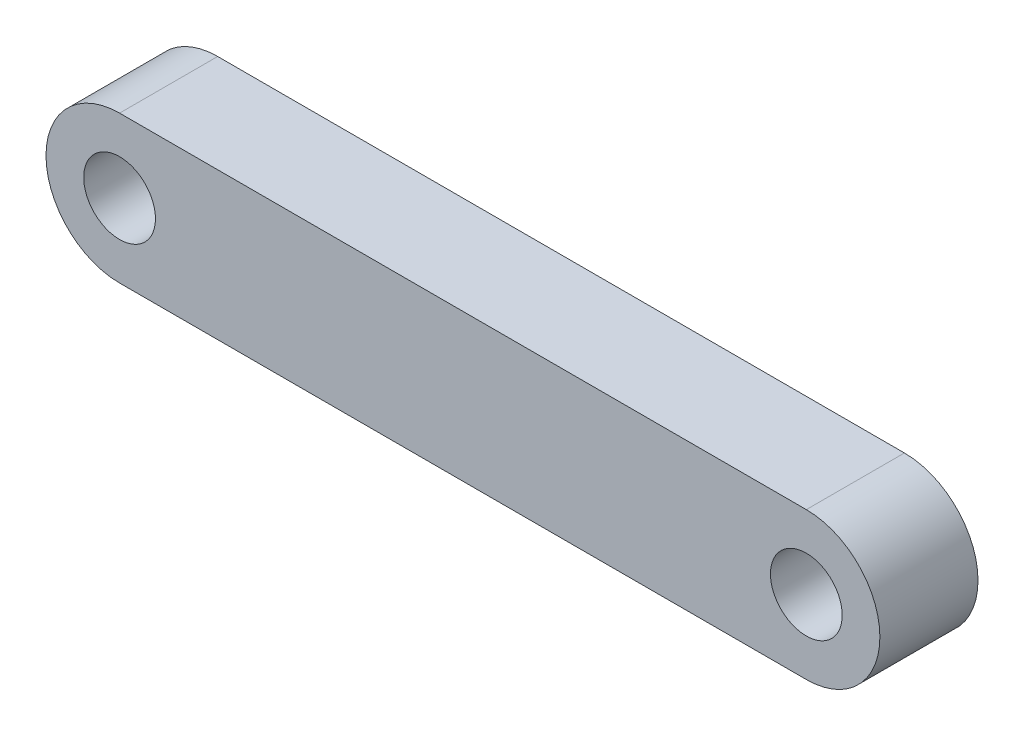
ISO-10303-21;
HEADER;
FILE_DESCRIPTION(('STEP AP214'),'2;1');
FILE_NAME('part.step','',(''),(''),'','','');
FILE_SCHEMA(('AUTOMOTIVE_DESIGN { 1 0 10303 214 1 1 1 1 }'));
ENDSEC;
DATA;
#1=APPLICATION_CONTEXT('core data for automotive mechanical design processes');
#2=APPLICATION_PROTOCOL_DEFINITION('international standard','automotive_design',2000,#1);
#3=PRODUCT_CONTEXT('',#1,'mechanical');
#4=PRODUCT('Part','Part','',(#3));
#5=PRODUCT_RELATED_PRODUCT_CATEGORY('part','',(#4));
#6=PRODUCT_DEFINITION_FORMATION('','',#4);
#7=PRODUCT_DEFINITION_CONTEXT('part definition',#1,'design');
#8=PRODUCT_DEFINITION('design','',#6,#7);
#9=PRODUCT_DEFINITION_SHAPE('','',#8);
#10=(LENGTH_UNIT() NAMED_UNIT(*) SI_UNIT(.MILLI.,.METRE.));
#11=(NAMED_UNIT(*) PLANE_ANGLE_UNIT() SI_UNIT($,.RADIAN.));
#12=(NAMED_UNIT(*) SI_UNIT($,.STERADIAN.) SOLID_ANGLE_UNIT());
#13=UNCERTAINTY_MEASURE_WITH_UNIT(LENGTH_MEASURE(1.E-05),#10,'distance_accuracy_value','');
#14=(GEOMETRIC_REPRESENTATION_CONTEXT(3) GLOBAL_UNCERTAINTY_ASSIGNED_CONTEXT((#13)) GLOBAL_UNIT_ASSIGNED_CONTEXT((#10,
#11,#12)) REPRESENTATION_CONTEXT('',''));
#15=CARTESIAN_POINT('',(0.,0.,0.));
#16=DIRECTION('',(0.,0.,1.));
#17=DIRECTION('',(1.,0.,0.));
#18=AXIS2_PLACEMENT_3D('',#15,#16,#17);
#19=CARTESIAN_POINT('',(0.,0.,10.));
#20=DIRECTION('',(0.,0.,1.));
#21=DIRECTION('',(1.,0.,0.));
#22=AXIS2_PLACEMENT_3D('',#19,#20,#21);
#23=PLANE('',#22);
#24=CARTESIAN_POINT('',(0.,0.,10.));
#25=DIRECTION('',(0.,0.,1.));
#26=DIRECTION('',(1.,0.,0.));
#27=AXIS2_PLACEMENT_3D('',#24,#25,#26);
#28=CIRCLE('',#27,3.6576);
#29=CARTESIAN_POINT('',(3.6576,0.,10.));
#30=VERTEX_POINT('',#29);
#31=EDGE_CURVE('E112',#30,#30,#28,.T.);
#32=ORIENTED_EDGE('',*,*,#31,.F.);
#33=EDGE_LOOP('',(#32));
#34=FACE_BOUND('',#33,.T.);
#35=CARTESIAN_POINT('',(0.,0.,10.));
#36=DIRECTION('',(0.,0.,1.));
#37=DIRECTION('',(1.,0.,0.));
#38=AXIS2_PLACEMENT_3D('',#35,#36,#37);
#39=CIRCLE('',#38,7.5);
#40=CARTESIAN_POINT('',(0.,7.5,10.));
#41=VERTEX_POINT('',#40);
#42=CARTESIAN_POINT('',(0.,-7.5,10.));
#43=VERTEX_POINT('',#42);
#44=EDGE_CURVE('E92',#41,#43,#39,.T.);
#45=ORIENTED_EDGE('',*,*,#44,.T.);
#46=DIRECTION('',(1.,0.,0.));
#47=VECTOR('',#46,1.);
#48=CARTESIAN_POINT('',(0.,-7.5,10.));
#49=LINE('',#48,#47);
#50=CARTESIAN_POINT('',(70.,-7.5,10.));
#51=VERTEX_POINT('',#50);
#52=EDGE_CURVE('E87',#43,#51,#49,.T.);
#53=ORIENTED_EDGE('',*,*,#52,.T.);
#54=CARTESIAN_POINT('',(70.,0.,10.));
#55=DIRECTION('',(0.,0.,1.));
#56=DIRECTION('',(1.,0.,0.));
#57=AXIS2_PLACEMENT_3D('',#54,#55,#56);
#58=CIRCLE('',#57,7.5);
#59=CARTESIAN_POINT('',(70.,7.5,10.));
#60=VERTEX_POINT('',#59);
#61=EDGE_CURVE('E90',#51,#60,#58,.T.);
#62=ORIENTED_EDGE('',*,*,#61,.T.);
#63=DIRECTION('',(-1.,0.,0.));
#64=VECTOR('',#63,1.);
#65=CARTESIAN_POINT('',(0.,7.5,10.));
#66=LINE('',#65,#64);
#67=EDGE_CURVE('E57',#60,#41,#66,.T.);
#68=ORIENTED_EDGE('',*,*,#67,.T.);
#69=EDGE_LOOP('',(#45,#53,#62,#68));
#70=FACE_BOUND('',#69,.T.);
#71=CARTESIAN_POINT('',(70.,0.,10.));
#72=DIRECTION('',(0.,0.,1.));
#73=DIRECTION('',(1.,0.,0.));
#74=AXIS2_PLACEMENT_3D('',#71,#72,#73);
#75=CIRCLE('',#74,3.6576);
#76=CARTESIAN_POINT('',(73.6576,0.,10.));
#77=VERTEX_POINT('',#76);
#78=EDGE_CURVE('E134',#77,#77,#75,.T.);
#79=ORIENTED_EDGE('',*,*,#78,.F.);
#80=EDGE_LOOP('',(#79));
#81=FACE_BOUND('',#80,.T.);
#82=ADVANCED_FACE('F39',(#34,#70,#81),#23,.T.);
#83=CARTESIAN_POINT('',(0.,0.,0.));
#84=DIRECTION('',(0.,0.,1.));
#85=DIRECTION('',(1.,0.,0.));
#86=AXIS2_PLACEMENT_3D('',#83,#84,#85);
#87=PLANE('',#86);
#88=CARTESIAN_POINT('',(0.,0.,0.));
#89=DIRECTION('',(0.,0.,1.));
#90=DIRECTION('',(1.,0.,0.));
#91=AXIS2_PLACEMENT_3D('',#88,#89,#90);
#92=CIRCLE('',#91,7.5);
#93=CARTESIAN_POINT('',(0.,7.5,0.));
#94=VERTEX_POINT('',#93);
#95=CARTESIAN_POINT('',(0.,-7.5,0.));
#96=VERTEX_POINT('',#95);
#97=EDGE_CURVE('E108',#94,#96,#92,.T.);
#98=ORIENTED_EDGE('',*,*,#97,.F.);
#99=DIRECTION('',(-1.,0.,0.));
#100=VECTOR('',#99,1.);
#101=CARTESIAN_POINT('',(0.,7.5,0.));
#102=LINE('',#101,#100);
#103=CARTESIAN_POINT('',(70.,7.5,0.));
#104=VERTEX_POINT('',#103);
#105=EDGE_CURVE('E80',#104,#94,#102,.T.);
#106=ORIENTED_EDGE('',*,*,#105,.F.);
#107=CARTESIAN_POINT('',(70.,0.,0.));
#108=DIRECTION('',(0.,0.,1.));
#109=DIRECTION('',(1.,0.,0.));
#110=AXIS2_PLACEMENT_3D('',#107,#108,#109);
#111=CIRCLE('',#110,7.5);
#112=CARTESIAN_POINT('',(70.,-7.5,0.));
#113=VERTEX_POINT('',#112);
#114=EDGE_CURVE('E74',#113,#104,#111,.T.);
#115=ORIENTED_EDGE('',*,*,#114,.F.);
#116=DIRECTION('',(1.,0.,0.));
#117=VECTOR('',#116,1.);
#118=CARTESIAN_POINT('',(0.,-7.5,0.));
#119=LINE('',#118,#117);
#120=EDGE_CURVE('E97',#96,#113,#119,.T.);
#121=ORIENTED_EDGE('',*,*,#120,.F.);
#122=EDGE_LOOP('',(#98,#106,#115,#121));
#123=FACE_BOUND('',#122,.T.);
#124=CARTESIAN_POINT('',(0.,0.,0.));
#125=DIRECTION('',(0.,0.,1.));
#126=DIRECTION('',(1.,0.,0.));
#127=AXIS2_PLACEMENT_3D('',#124,#125,#126);
#128=CIRCLE('',#127,3.6576);
#129=CARTESIAN_POINT('',(3.6576,0.,0.));
#130=VERTEX_POINT('',#129);
#131=EDGE_CURVE('E130',#130,#130,#128,.T.);
#132=ORIENTED_EDGE('',*,*,#131,.T.);
#133=EDGE_LOOP('',(#132));
#134=FACE_BOUND('',#133,.T.);
#135=CARTESIAN_POINT('',(70.,0.,0.));
#136=DIRECTION('',(0.,0.,1.));
#137=DIRECTION('',(1.,0.,0.));
#138=AXIS2_PLACEMENT_3D('',#135,#136,#137);
#139=CIRCLE('',#138,3.6576);
#140=CARTESIAN_POINT('',(73.6576,0.,0.));
#141=VERTEX_POINT('',#140);
#142=EDGE_CURVE('E138',#141,#141,#139,.T.);
#143=ORIENTED_EDGE('',*,*,#142,.T.);
#144=EDGE_LOOP('',(#143));
#145=FACE_BOUND('',#144,.T.);
#146=ADVANCED_FACE('F125',(#123,#134,#145),#87,.F.);
#147=CARTESIAN_POINT('',(0.,0.,10.));
#148=DIRECTION('',(0.,0.,-1.));
#149=DIRECTION('',(-1.,0.,0.));
#150=AXIS2_PLACEMENT_3D('',#147,#148,#149);
#151=CYLINDRICAL_SURFACE('',#150,7.5);
#152=ORIENTED_EDGE('',*,*,#97,.T.);
#153=DIRECTION('',(0.,0.,-1.));
#154=VECTOR('',#153,1.);
#155=CARTESIAN_POINT('',(0.,-7.5,10.));
#156=LINE('',#155,#154);
#157=EDGE_CURVE('E11',#43,#96,#156,.T.);
#158=ORIENTED_EDGE('',*,*,#157,.F.);
#159=ORIENTED_EDGE('',*,*,#44,.F.);
#160=DIRECTION('',(0.,0.,-1.));
#161=VECTOR('',#160,1.);
#162=CARTESIAN_POINT('',(0.,7.5,10.));
#163=LINE('',#162,#161);
#164=EDGE_CURVE('E104',#41,#94,#163,.T.);
#165=ORIENTED_EDGE('',*,*,#164,.T.);
#166=EDGE_LOOP('',(#152,#158,#159,#165));
#167=FACE_BOUND('',#166,.T.);
#168=ADVANCED_FACE('F41',(#167),#151,.T.);
#169=CARTESIAN_POINT('',(0.,-7.5,10.));
#170=DIRECTION('',(0.,1.,0.));
#171=DIRECTION('',(0.,0.,1.));
#172=AXIS2_PLACEMENT_3D('',#169,#170,#171);
#173=PLANE('',#172);
#174=ORIENTED_EDGE('',*,*,#120,.T.);
#175=DIRECTION('',(0.,0.,-1.));
#176=VECTOR('',#175,1.);
#177=CARTESIAN_POINT('',(70.,-7.5,10.));
#178=LINE('',#177,#176);
#179=EDGE_CURVE('E49',#51,#113,#178,.T.);
#180=ORIENTED_EDGE('',*,*,#179,.F.);
#181=ORIENTED_EDGE('',*,*,#52,.F.);
#182=ORIENTED_EDGE('',*,*,#157,.T.);
#183=EDGE_LOOP('',(#174,#180,#181,#182));
#184=FACE_BOUND('',#183,.T.);
#185=ADVANCED_FACE('F96',(#184),#173,.F.);
#186=CARTESIAN_POINT('',(70.,0.,10.));
#187=DIRECTION('',(0.,0.,-1.));
#188=DIRECTION('',(-1.,0.,0.));
#189=AXIS2_PLACEMENT_3D('',#186,#187,#188);
#190=CYLINDRICAL_SURFACE('',#189,7.5);
#191=ORIENTED_EDGE('',*,*,#114,.T.);
#192=DIRECTION('',(0.,0.,-1.));
#193=VECTOR('',#192,1.);
#194=CARTESIAN_POINT('',(70.,7.5,10.));
#195=LINE('',#194,#193);
#196=EDGE_CURVE('E99',#60,#104,#195,.T.);
#197=ORIENTED_EDGE('',*,*,#196,.F.);
#198=ORIENTED_EDGE('',*,*,#61,.F.);
#199=ORIENTED_EDGE('',*,*,#179,.T.);
#200=EDGE_LOOP('',(#191,#197,#198,#199));
#201=FACE_BOUND('',#200,.T.);
#202=ADVANCED_FACE('F100',(#201),#190,.T.);
#203=CARTESIAN_POINT('',(0.,7.5,10.));
#204=DIRECTION('',(0.,-1.,0.));
#205=DIRECTION('',(0.,0.,-1.));
#206=AXIS2_PLACEMENT_3D('',#203,#204,#205);
#207=PLANE('',#206);
#208=ORIENTED_EDGE('',*,*,#105,.T.);
#209=ORIENTED_EDGE('',*,*,#164,.F.);
#210=ORIENTED_EDGE('',*,*,#67,.F.);
#211=ORIENTED_EDGE('',*,*,#196,.T.);
#212=EDGE_LOOP('',(#208,#209,#210,#211));
#213=FACE_BOUND('',#212,.T.);
#214=ADVANCED_FACE('F122',(#213),#207,.F.);
#215=CARTESIAN_POINT('',(0.,0.,10.));
#216=DIRECTION('',(0.,0.,-1.));
#217=DIRECTION('',(-1.,0.,0.));
#218=AXIS2_PLACEMENT_3D('',#215,#216,#217);
#219=CYLINDRICAL_SURFACE('',#218,3.6576);
#220=ORIENTED_EDGE('',*,*,#31,.T.);
#221=EDGE_LOOP('',(#220));
#222=FACE_BOUND('',#221,.T.);
#223=ORIENTED_EDGE('',*,*,#131,.F.);
#224=EDGE_LOOP('',(#223));
#225=FACE_BOUND('',#224,.T.);
#226=ADVANCED_FACE('F157',(#222,#225),#219,.F.);
#227=CARTESIAN_POINT('',(70.,0.,10.));
#228=DIRECTION('',(0.,0.,-1.));
#229=DIRECTION('',(-1.,0.,0.));
#230=AXIS2_PLACEMENT_3D('',#227,#228,#229);
#231=CYLINDRICAL_SURFACE('',#230,3.6576);
#232=ORIENTED_EDGE('',*,*,#78,.T.);
#233=EDGE_LOOP('',(#232));
#234=FACE_BOUND('',#233,.T.);
#235=ORIENTED_EDGE('',*,*,#142,.F.);
#236=EDGE_LOOP('',(#235));
#237=FACE_BOUND('',#236,.T.);
#238=ADVANCED_FACE('F146',(#234,#237),#231,.F.);
#239=CLOSED_SHELL('',(#82,#146,#168,#185,#202,#214,#226,#238));
#240=MANIFOLD_SOLID_BREP('B2',#239);
#241=ADVANCED_BREP_SHAPE_REPRESENTATION('',(#18,#240),#14);
#242=SHAPE_DEFINITION_REPRESENTATION(#9,#241);
ENDSEC;
END-ISO-10303-21;
